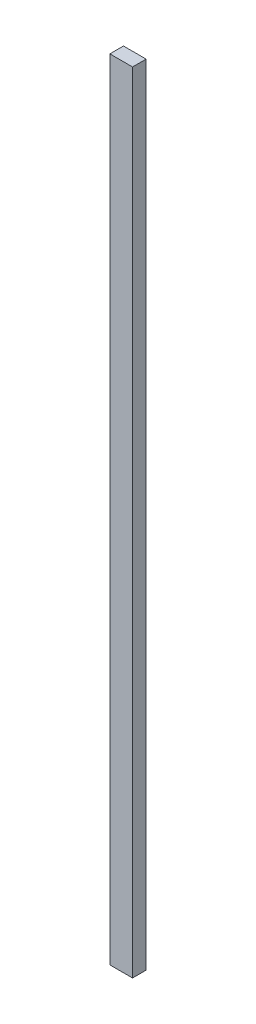
ISO-10303-21;
HEADER;
FILE_DESCRIPTION(('STEP AP214'),'2;1');
FILE_NAME('part.step','',(''),(''),'','','');
FILE_SCHEMA(('AUTOMOTIVE_DESIGN { 1 0 10303 214 1 1 1 1 }'));
ENDSEC;
DATA;
#1=APPLICATION_CONTEXT('core data for automotive mechanical design processes');
#2=APPLICATION_PROTOCOL_DEFINITION('international standard','automotive_design',2000,#1);
#3=PRODUCT_CONTEXT('',#1,'mechanical');
#4=PRODUCT('Part','Part','',(#3));
#5=PRODUCT_RELATED_PRODUCT_CATEGORY('part','',(#4));
#6=PRODUCT_DEFINITION_FORMATION('','',#4);
#7=PRODUCT_DEFINITION_CONTEXT('part definition',#1,'design');
#8=PRODUCT_DEFINITION('design','',#6,#7);
#9=PRODUCT_DEFINITION_SHAPE('','',#8);
#10=(LENGTH_UNIT() NAMED_UNIT(*) SI_UNIT(.MILLI.,.METRE.));
#11=(NAMED_UNIT(*) PLANE_ANGLE_UNIT() SI_UNIT($,.RADIAN.));
#12=(NAMED_UNIT(*) SI_UNIT($,.STERADIAN.) SOLID_ANGLE_UNIT());
#13=UNCERTAINTY_MEASURE_WITH_UNIT(LENGTH_MEASURE(1.E-05),#10,'distance_accuracy_value','');
#14=(GEOMETRIC_REPRESENTATION_CONTEXT(3) GLOBAL_UNCERTAINTY_ASSIGNED_CONTEXT((#13)) GLOBAL_UNIT_ASSIGNED_CONTEXT((#10,
#11,#12)) REPRESENTATION_CONTEXT('',''));
#15=CARTESIAN_POINT('',(0.,0.,0.));
#16=DIRECTION('',(0.,0.,1.));
#17=DIRECTION('',(1.,0.,0.));
#18=AXIS2_PLACEMENT_3D('',#15,#16,#17);
#19=CARTESIAN_POINT('',(1.17,0.546,0.24));
#20=DIRECTION('',(-1.,0.,0.));
#21=DIRECTION('',(0.,0.,1.));
#22=AXIS2_PLACEMENT_3D('',#19,#20,#21);
#23=PLANE('',#22);
#24=DIRECTION('',(0.,-1.,0.));
#25=VECTOR('',#24,1.);
#26=CARTESIAN_POINT('',(1.17,-0.784,-0.22));
#27=LINE('',#26,#25);
#28=CARTESIAN_POINT('',(1.17,0.87,-0.22));
#29=VERTEX_POINT('',#28);
#30=CARTESIAN_POINT('',(1.17,-0.87,-0.22));
#31=VERTEX_POINT('',#30);
#32=EDGE_CURVE('E37',#29,#31,#27,.T.);
#33=ORIENTED_EDGE('',*,*,#32,.F.);
#34=DIRECTION('',(0.,0.,-1.));
#35=VECTOR('',#34,1.);
#36=CARTESIAN_POINT('',(1.17,0.87,0.22));
#37=LINE('',#36,#35);
#38=CARTESIAN_POINT('',(1.17,0.87,-0.25));
#39=VERTEX_POINT('',#38);
#40=EDGE_CURVE('E83',#29,#39,#37,.T.);
#41=ORIENTED_EDGE('',*,*,#40,.T.);
#42=DIRECTION('',(0.,1.,0.));
#43=VECTOR('',#42,1.);
#44=CARTESIAN_POINT('',(1.17,0.,-0.25));
#45=LINE('',#44,#43);
#46=CARTESIAN_POINT('',(1.17,-0.87,-0.25));
#47=VERTEX_POINT('',#46);
#48=EDGE_CURVE('E89',#47,#39,#45,.T.);
#49=ORIENTED_EDGE('',*,*,#48,.F.);
#50=DIRECTION('',(0.,0.,1.));
#51=VECTOR('',#50,1.);
#52=CARTESIAN_POINT('',(1.17,-0.87,0.22));
#53=LINE('',#52,#51);
#54=EDGE_CURVE('E80',#47,#31,#53,.T.);
#55=ORIENTED_EDGE('',*,*,#54,.T.);
#56=EDGE_LOOP('',(#33,#41,#49,#55));
#57=FACE_BOUND('',#56,.T.);
#58=ADVANCED_FACE('F33',(#57),#23,.T.);
#59=CARTESIAN_POINT('',(1.17,0.832,-0.22));
#60=DIRECTION('',(0.,0.,1.));
#61=DIRECTION('',(0.,-1.,0.));
#62=AXIS2_PLACEMENT_3D('',#59,#60,#61);
#63=PLANE('',#62);
#64=DIRECTION('',(0.,-1.,0.));
#65=VECTOR('',#64,1.);
#66=CARTESIAN_POINT('',(1.22,0.,-0.22));
#67=LINE('',#66,#65);
#68=CARTESIAN_POINT('',(1.22,0.87,-0.22));
#69=VERTEX_POINT('',#68);
#70=CARTESIAN_POINT('',(1.22,-0.87,-0.22));
#71=VERTEX_POINT('',#70);
#72=EDGE_CURVE('E95',#69,#71,#67,.T.);
#73=ORIENTED_EDGE('',*,*,#72,.F.);
#74=DIRECTION('',(-1.,0.,0.));
#75=VECTOR('',#74,1.);
#76=CARTESIAN_POINT('',(0.03,0.87,-0.22));
#77=LINE('',#76,#75);
#78=EDGE_CURVE('E93',#69,#29,#77,.T.);
#79=ORIENTED_EDGE('',*,*,#78,.T.);
#80=ORIENTED_EDGE('',*,*,#32,.T.);
#81=DIRECTION('',(1.,0.,0.));
#82=VECTOR('',#81,1.);
#83=CARTESIAN_POINT('',(0.03,-0.87,-0.22));
#84=LINE('',#83,#82);
#85=EDGE_CURVE('E77',#31,#71,#84,.T.);
#86=ORIENTED_EDGE('',*,*,#85,.T.);
#87=EDGE_LOOP('',(#73,#79,#80,#86));
#88=FACE_BOUND('',#87,.T.);
#89=ADVANCED_FACE('F91',(#88),#63,.T.);
#90=CARTESIAN_POINT('',(0.03,0.87,0.22));
#91=DIRECTION('',(0.,-1.,0.));
#92=DIRECTION('',(0.,0.,-1.));
#93=AXIS2_PLACEMENT_3D('',#90,#91,#92);
#94=PLANE('',#93);
#95=ORIENTED_EDGE('',*,*,#78,.F.);
#96=DIRECTION('',(0.,0.,1.));
#97=VECTOR('',#96,1.);
#98=CARTESIAN_POINT('',(1.22,0.87,-0.22));
#99=LINE('',#98,#97);
#100=CARTESIAN_POINT('',(1.22,0.87,-0.25));
#101=VERTEX_POINT('',#100);
#102=EDGE_CURVE('E102',#101,#69,#99,.T.);
#103=ORIENTED_EDGE('',*,*,#102,.F.);
#104=DIRECTION('',(1.,0.,0.));
#105=VECTOR('',#104,1.);
#106=CARTESIAN_POINT('',(1.22,0.87,-0.25));
#107=LINE('',#106,#105);
#108=EDGE_CURVE('E57',#39,#101,#107,.T.);
#109=ORIENTED_EDGE('',*,*,#108,.F.);
#110=ORIENTED_EDGE('',*,*,#40,.F.);
#111=EDGE_LOOP('',(#95,#103,#109,#110));
#112=FACE_BOUND('',#111,.T.);
#113=ADVANCED_FACE('F35',(#112),#94,.F.);
#114=CARTESIAN_POINT('',(1.22,0.,0.));
#115=DIRECTION('',(1.,0.,0.));
#116=DIRECTION('',(0.,0.,-1.));
#117=AXIS2_PLACEMENT_3D('',#114,#115,#116);
#118=PLANE('',#117);
#119=ORIENTED_EDGE('',*,*,#102,.T.);
#120=ORIENTED_EDGE('',*,*,#72,.T.);
#121=DIRECTION('',(0.,0.,-1.));
#122=VECTOR('',#121,1.);
#123=CARTESIAN_POINT('',(1.22,-0.87,0.22));
#124=LINE('',#123,#122);
#125=CARTESIAN_POINT('',(1.22,-0.87,-0.25));
#126=VERTEX_POINT('',#125);
#127=EDGE_CURVE('E50',#71,#126,#124,.T.);
#128=ORIENTED_EDGE('',*,*,#127,.T.);
#129=DIRECTION('',(0.,-1.,0.));
#130=VECTOR('',#129,1.);
#131=CARTESIAN_POINT('',(1.22,0.87,-0.25));
#132=LINE('',#131,#130);
#133=EDGE_CURVE('E11',#101,#126,#132,.T.);
#134=ORIENTED_EDGE('',*,*,#133,.F.);
#135=EDGE_LOOP('',(#119,#120,#128,#134));
#136=FACE_BOUND('',#135,.T.);
#137=ADVANCED_FACE('F106',(#136),#118,.T.);
#138=CARTESIAN_POINT('',(0.,0.,-0.25));
#139=DIRECTION('',(0.,0.,-1.));
#140=DIRECTION('',(0.,1.,0.));
#141=AXIS2_PLACEMENT_3D('',#138,#139,#140);
#142=PLANE('',#141);
#143=DIRECTION('',(-1.,0.,0.));
#144=VECTOR('',#143,1.);
#145=CARTESIAN_POINT('',(1.22,-0.87,-0.25));
#146=LINE('',#145,#144);
#147=EDGE_CURVE('E42',#126,#47,#146,.T.);
#148=ORIENTED_EDGE('',*,*,#147,.T.);
#149=ORIENTED_EDGE('',*,*,#48,.T.);
#150=ORIENTED_EDGE('',*,*,#108,.T.);
#151=ORIENTED_EDGE('',*,*,#133,.T.);
#152=EDGE_LOOP('',(#148,#149,#150,#151));
#153=FACE_BOUND('',#152,.T.);
#154=ADVANCED_FACE('F107',(#153),#142,.T.);
#155=CARTESIAN_POINT('',(0.03,-0.87,0.22));
#156=DIRECTION('',(0.,1.,0.));
#157=DIRECTION('',(0.,0.,1.));
#158=AXIS2_PLACEMENT_3D('',#155,#156,#157);
#159=PLANE('',#158);
#160=ORIENTED_EDGE('',*,*,#85,.F.);
#161=ORIENTED_EDGE('',*,*,#54,.F.);
#162=ORIENTED_EDGE('',*,*,#147,.F.);
#163=ORIENTED_EDGE('',*,*,#127,.F.);
#164=EDGE_LOOP('',(#160,#161,#162,#163));
#165=FACE_BOUND('',#164,.T.);
#166=ADVANCED_FACE('F79',(#165),#159,.F.);
#167=CLOSED_SHELL('',(#58,#89,#113,#137,#154,#166));
#168=MANIFOLD_SOLID_BREP('B2',#167);
#169=ADVANCED_BREP_SHAPE_REPRESENTATION('',(#18,#168),#14);
#170=SHAPE_DEFINITION_REPRESENTATION(#9,#169);
ENDSEC;
END-ISO-10303-21;
